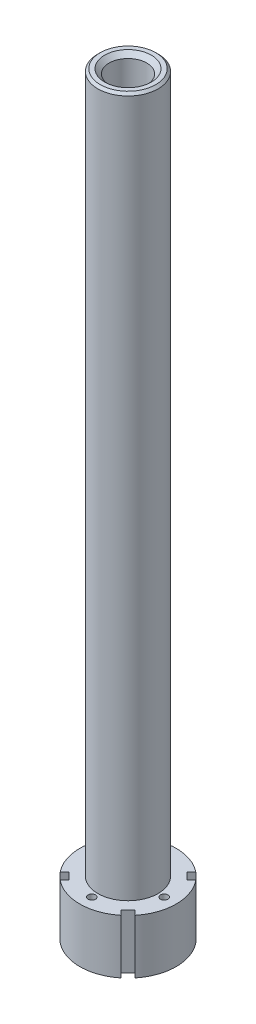
ISO-10303-21;
HEADER;
FILE_DESCRIPTION(('STEP AP214'),'2;1');
FILE_NAME('part.step','',(''),(''),'','','');
FILE_SCHEMA(('AUTOMOTIVE_DESIGN { 1 0 10303 214 1 1 1 1 }'));
ENDSEC;
DATA;
#1=APPLICATION_CONTEXT('core data for automotive mechanical design processes');
#2=APPLICATION_PROTOCOL_DEFINITION('international standard','automotive_design',2000,#1);
#3=PRODUCT_CONTEXT('',#1,'mechanical');
#4=PRODUCT('Part','Part','',(#3));
#5=PRODUCT_RELATED_PRODUCT_CATEGORY('part','',(#4));
#6=PRODUCT_DEFINITION_FORMATION('','',#4);
#7=PRODUCT_DEFINITION_CONTEXT('part definition',#1,'design');
#8=PRODUCT_DEFINITION('design','',#6,#7);
#9=PRODUCT_DEFINITION_SHAPE('','',#8);
#10=(LENGTH_UNIT() NAMED_UNIT(*) SI_UNIT(.MILLI.,.METRE.));
#11=(NAMED_UNIT(*) PLANE_ANGLE_UNIT() SI_UNIT($,.RADIAN.));
#12=(NAMED_UNIT(*) SI_UNIT($,.STERADIAN.) SOLID_ANGLE_UNIT());
#13=UNCERTAINTY_MEASURE_WITH_UNIT(LENGTH_MEASURE(1.E-05),#10,'distance_accuracy_value','');
#14=(GEOMETRIC_REPRESENTATION_CONTEXT(3) GLOBAL_UNCERTAINTY_ASSIGNED_CONTEXT((#13)) GLOBAL_UNIT_ASSIGNED_CONTEXT((#10,
#11,#12)) REPRESENTATION_CONTEXT('',''));
#15=CARTESIAN_POINT('',(0.,0.,0.));
#16=DIRECTION('',(0.,0.,1.));
#17=DIRECTION('',(1.,0.,0.));
#18=AXIS2_PLACEMENT_3D('',#15,#16,#17);
#19=CARTESIAN_POINT('',(0.,18.,0.));
#20=DIRECTION('',(0.,-1.,0.));
#21=DIRECTION('',(0.,0.,-1.));
#22=AXIS2_PLACEMENT_3D('',#19,#20,#21);
#23=CYLINDRICAL_SURFACE('',#22,16.);
#24=CARTESIAN_POINT('',(0.,0.,0.));
#25=DIRECTION('',(0.,-1.,0.));
#26=DIRECTION('',(0.,0.,-1.));
#27=AXIS2_PLACEMENT_3D('',#24,#25,#26);
#28=CIRCLE('',#27,16.);
#29=CARTESIAN_POINT('',(-10.1256269736777,0.,-12.3883686734748));
#30=VERTEX_POINT('',#29);
#31=CARTESIAN_POINT('',(10.1256269736778,0.,-12.3883686734747));
#32=VERTEX_POINT('',#31);
#33=EDGE_CURVE('E270',#30,#32,#28,.T.);
#34=ORIENTED_EDGE('',*,*,#33,.F.);
#35=DIRECTION('',(0.,-1.,0.));
#36=VECTOR('',#35,1.);
#37=CARTESIAN_POINT('',(-10.1256269736777,18.,-12.3883686734748));
#38=LINE('',#37,#36);
#39=CARTESIAN_POINT('',(-10.1256269736777,18.,-12.3883686734748));
#40=VERTEX_POINT('',#39);
#41=EDGE_CURVE('E197',#30,#40,#38,.F.);
#42=ORIENTED_EDGE('',*,*,#41,.T.);
#43=CARTESIAN_POINT('',(0.,18.,0.));
#44=DIRECTION('',(0.,-1.,0.));
#45=DIRECTION('',(0.,0.,-1.));
#46=AXIS2_PLACEMENT_3D('',#43,#44,#45);
#47=CIRCLE('',#46,16.);
#48=CARTESIAN_POINT('',(10.1256269736778,18.,-12.3883686734747));
#49=VERTEX_POINT('',#48);
#50=EDGE_CURVE('E266',#40,#49,#47,.T.);
#51=ORIENTED_EDGE('',*,*,#50,.T.);
#52=DIRECTION('',(0.,-1.,0.));
#53=VECTOR('',#52,1.);
#54=CARTESIAN_POINT('',(10.1256269736778,18.,-12.3883686734747));
#55=LINE('',#54,#53);
#56=EDGE_CURVE('E192',#32,#49,#55,.F.);
#57=ORIENTED_EDGE('',*,*,#56,.F.);
#58=EDGE_LOOP('',(#34,#42,#51,#57));
#59=FACE_BOUND('',#58,.T.);
#60=ADVANCED_FACE('F45',(#59),#23,.T.);
#61=CARTESIAN_POINT('',(12.3883686734747,0.,-10.1256269736777));
#62=VERTEX_POINT('',#61);
#63=CARTESIAN_POINT('',(12.3883686734746,0.,10.1256269736779));
#64=VERTEX_POINT('',#63);
#65=EDGE_CURVE('E392',#62,#64,#28,.T.);
#66=ORIENTED_EDGE('',*,*,#65,.F.);
#67=DIRECTION('',(0.,-1.,0.));
#68=VECTOR('',#67,1.);
#69=CARTESIAN_POINT('',(12.3883686734747,18.,-10.1256269736777));
#70=LINE('',#69,#68);
#71=CARTESIAN_POINT('',(12.3883686734747,18.,-10.1256269736777));
#72=VERTEX_POINT('',#71);
#73=EDGE_CURVE('E68',#62,#72,#70,.F.);
#74=ORIENTED_EDGE('',*,*,#73,.T.);
#75=CARTESIAN_POINT('',(12.3883686734746,18.,10.1256269736779));
#76=VERTEX_POINT('',#75);
#77=EDGE_CURVE('E400',#72,#76,#47,.T.);
#78=ORIENTED_EDGE('',*,*,#77,.T.);
#79=DIRECTION('',(0.,-1.,0.));
#80=VECTOR('',#79,1.);
#81=CARTESIAN_POINT('',(12.3883686734746,18.,10.1256269736779));
#82=LINE('',#81,#80);
#83=EDGE_CURVE('E169',#64,#76,#82,.F.);
#84=ORIENTED_EDGE('',*,*,#83,.F.);
#85=EDGE_LOOP('',(#66,#74,#78,#84));
#86=FACE_BOUND('',#85,.T.);
#87=ADVANCED_FACE('F328',(#86),#23,.T.);
#88=CARTESIAN_POINT('',(10.1256269736776,0.,12.3883686734748));
#89=VERTEX_POINT('',#88);
#90=CARTESIAN_POINT('',(-10.1256269736778,0.,12.3883686734747));
#91=VERTEX_POINT('',#90);
#92=EDGE_CURVE('E271',#89,#91,#28,.T.);
#93=ORIENTED_EDGE('',*,*,#92,.F.);
#94=DIRECTION('',(0.,-1.,0.));
#95=VECTOR('',#94,1.);
#96=CARTESIAN_POINT('',(10.1256269736776,18.,12.3883686734748));
#97=LINE('',#96,#95);
#98=CARTESIAN_POINT('',(10.1256269736776,18.,12.3883686734748));
#99=VERTEX_POINT('',#98);
#100=EDGE_CURVE('E60',#89,#99,#97,.F.);
#101=ORIENTED_EDGE('',*,*,#100,.T.);
#102=CARTESIAN_POINT('',(-10.1256269736778,18.,12.3883686734747));
#103=VERTEX_POINT('',#102);
#104=EDGE_CURVE('E179',#99,#103,#47,.T.);
#105=ORIENTED_EDGE('',*,*,#104,.T.);
#106=DIRECTION('',(0.,-1.,0.));
#107=VECTOR('',#106,1.);
#108=CARTESIAN_POINT('',(-10.1256269736778,18.,12.3883686734747));
#109=LINE('',#108,#107);
#110=EDGE_CURVE('E222',#91,#103,#109,.F.);
#111=ORIENTED_EDGE('',*,*,#110,.F.);
#112=EDGE_LOOP('',(#93,#101,#105,#111));
#113=FACE_BOUND('',#112,.T.);
#114=ADVANCED_FACE('F336',(#113),#23,.T.);
#115=DIRECTION('',(0.,-1.,0.));
#116=VECTOR('',#115,1.);
#117=CARTESIAN_POINT('',(-12.3883686734747,18.,-10.1256269736778));
#118=LINE('',#117,#116);
#119=CARTESIAN_POINT('',(-12.3883686734747,0.,-10.1256269736778));
#120=VERTEX_POINT('',#119);
#121=CARTESIAN_POINT('',(-12.3883686734747,18.,-10.1256269736778));
#122=VERTEX_POINT('',#121);
#123=EDGE_CURVE('E204',#120,#122,#118,.F.);
#124=ORIENTED_EDGE('',*,*,#123,.F.);
#125=CARTESIAN_POINT('',(-12.3883686734747,0.,10.1256269736777));
#126=VERTEX_POINT('',#125);
#127=EDGE_CURVE('E267',#126,#120,#28,.T.);
#128=ORIENTED_EDGE('',*,*,#127,.F.);
#129=DIRECTION('',(0.,-1.,0.));
#130=VECTOR('',#129,1.);
#131=CARTESIAN_POINT('',(-12.3883686734747,18.,10.1256269736777));
#132=LINE('',#131,#130);
#133=CARTESIAN_POINT('',(-12.3883686734747,18.,10.1256269736777));
#134=VERTEX_POINT('',#133);
#135=EDGE_CURVE('E213',#126,#134,#132,.F.);
#136=ORIENTED_EDGE('',*,*,#135,.T.);
#137=EDGE_CURVE('E262',#134,#122,#47,.T.);
#138=ORIENTED_EDGE('',*,*,#137,.T.);
#139=EDGE_LOOP('',(#124,#128,#136,#138));
#140=FACE_BOUND('',#139,.T.);
#141=ADVANCED_FACE('F331',(#140),#23,.T.);
#142=CARTESIAN_POINT('',(0.,-40.,0.));
#143=DIRECTION('',(0.,1.,0.));
#144=DIRECTION('',(0.,0.,1.));
#145=AXIS2_PLACEMENT_3D('',#142,#143,#144);
#146=CYLINDRICAL_SURFACE('',#145,6.);
#147=CARTESIAN_POINT('',(0.,214.849784845243,0.));
#148=DIRECTION('',(0.,1.,0.));
#149=DIRECTION('',(0.,0.,1.));
#150=AXIS2_PLACEMENT_3D('',#147,#148,#149);
#151=CIRCLE('',#150,6.);
#152=CARTESIAN_POINT('',(0.,214.849784845243,6.));
#153=VERTEX_POINT('',#152);
#154=EDGE_CURVE('E261',#153,#153,#151,.F.);
#155=ORIENTED_EDGE('',*,*,#154,.F.);
#156=EDGE_LOOP('',(#155));
#157=FACE_BOUND('',#156,.T.);
#158=CARTESIAN_POINT('',(0.,15.5,0.));
#159=DIRECTION('',(0.,-1.,0.));
#160=DIRECTION('',(0.,0.,-1.));
#161=AXIS2_PLACEMENT_3D('',#158,#159,#160);
#162=CIRCLE('',#161,6.);
#163=CARTESIAN_POINT('',(0.,15.5,-6.));
#164=VERTEX_POINT('',#163);
#165=EDGE_CURVE('E255',#164,#164,#162,.T.);
#166=ORIENTED_EDGE('',*,*,#165,.T.);
#167=EDGE_LOOP('',(#166));
#168=FACE_BOUND('',#167,.T.);
#169=ADVANCED_FACE('F342',(#157,#168),#146,.F.);
#170=CARTESIAN_POINT('',(0.,250.,0.));
#171=DIRECTION('',(0.,-1.,0.));
#172=DIRECTION('',(0.,0.,-1.));
#173=AXIS2_PLACEMENT_3D('',#170,#171,#172);
#174=CYLINDRICAL_SURFACE('',#173,10.);
#175=CARTESIAN_POINT('',(0.,249.2,0.));
#176=DIRECTION('',(0.,1.,0.));
#177=DIRECTION('',(0.,0.,1.));
#178=AXIS2_PLACEMENT_3D('',#175,#176,#177);
#179=CIRCLE('',#178,10.);
#180=CARTESIAN_POINT('',(0.,249.2,10.));
#181=VERTEX_POINT('',#180);
#182=EDGE_CURVE('E11',#181,#181,#179,.F.);
#183=ORIENTED_EDGE('',*,*,#182,.T.);
#184=EDGE_LOOP('',(#183));
#185=FACE_BOUND('',#184,.T.);
#186=CARTESIAN_POINT('',(0.,18.,0.));
#187=DIRECTION('',(0.,-1.,0.));
#188=DIRECTION('',(0.,0.,-1.));
#189=AXIS2_PLACEMENT_3D('',#186,#187,#188);
#190=CIRCLE('',#189,10.);
#191=CARTESIAN_POINT('',(0.,18.,-10.));
#192=VERTEX_POINT('',#191);
#193=EDGE_CURVE('E265',#192,#192,#190,.T.);
#194=ORIENTED_EDGE('',*,*,#193,.F.);
#195=EDGE_LOOP('',(#194));
#196=FACE_BOUND('',#195,.T.);
#197=ADVANCED_FACE('F349',(#185,#196),#174,.T.);
#198=CARTESIAN_POINT('',(0.,250.,0.));
#199=DIRECTION('',(0.,1.,0.));
#200=DIRECTION('',(0.,0.,1.));
#201=AXIS2_PLACEMENT_3D('',#198,#199,#200);
#202=PLANE('',#201);
#203=CARTESIAN_POINT('',(0.,250.,0.));
#204=DIRECTION('',(0.,1.,0.));
#205=DIRECTION('',(0.,0.,1.));
#206=AXIS2_PLACEMENT_3D('',#203,#204,#205);
#207=CIRCLE('',#206,9.20000000000004);
#208=CARTESIAN_POINT('',(0.,250.,9.20000000000004));
#209=VERTEX_POINT('',#208);
#210=EDGE_CURVE('E53',#209,#209,#207,.T.);
#211=ORIENTED_EDGE('',*,*,#210,.T.);
#212=EDGE_LOOP('',(#211));
#213=FACE_BOUND('',#212,.T.);
#214=CARTESIAN_POINT('',(0.,250.,0.));
#215=DIRECTION('',(0.,1.,0.));
#216=DIRECTION('',(0.,0.,1.));
#217=AXIS2_PLACEMENT_3D('',#214,#215,#216);
#218=CIRCLE('',#217,7.75000000000006);
#219=CARTESIAN_POINT('',(0.,250.,7.75000000000006));
#220=VERTEX_POINT('',#219);
#221=EDGE_CURVE('E279',#220,#220,#218,.F.);
#222=ORIENTED_EDGE('',*,*,#221,.T.);
#223=EDGE_LOOP('',(#222));
#224=FACE_BOUND('',#223,.T.);
#225=ADVANCED_FACE('F313',(#213,#224),#202,.T.);
#226=CARTESIAN_POINT('',(0.,18.,0.));
#227=DIRECTION('',(0.,-1.,0.));
#228=DIRECTION('',(0.,0.,-1.));
#229=AXIS2_PLACEMENT_3D('',#226,#227,#228);
#230=PLANE('',#229);
#231=CARTESIAN_POINT('',(0.,18.,-12.));
#232=DIRECTION('',(0.,-1.,0.));
#233=DIRECTION('',(0.,0.,-1.));
#234=AXIS2_PLACEMENT_3D('',#231,#232,#233);
#235=CIRCLE('',#234,1.25);
#236=CARTESIAN_POINT('',(0.,18.,-13.25));
#237=VERTEX_POINT('',#236);
#238=EDGE_CURVE('E230',#237,#237,#235,.T.);
#239=ORIENTED_EDGE('',*,*,#238,.T.);
#240=EDGE_LOOP('',(#239));
#241=FACE_BOUND('',#240,.T.);
#242=CARTESIAN_POINT('',(-12.,18.,0.));
#243=DIRECTION('',(0.,-1.,0.));
#244=DIRECTION('',(0.,0.,-1.));
#245=AXIS2_PLACEMENT_3D('',#242,#243,#244);
#246=CIRCLE('',#245,1.25);
#247=CARTESIAN_POINT('',(-12.,18.,-1.25));
#248=VERTEX_POINT('',#247);
#249=EDGE_CURVE('E236',#248,#248,#246,.T.);
#250=ORIENTED_EDGE('',*,*,#249,.T.);
#251=EDGE_LOOP('',(#250));
#252=FACE_BOUND('',#251,.T.);
#253=CARTESIAN_POINT('',(0.,18.,12.));
#254=DIRECTION('',(0.,-1.,0.));
#255=DIRECTION('',(0.,0.,-1.));
#256=AXIS2_PLACEMENT_3D('',#253,#254,#255);
#257=CIRCLE('',#256,1.25);
#258=CARTESIAN_POINT('',(0.,18.,10.75));
#259=VERTEX_POINT('',#258);
#260=EDGE_CURVE('E242',#259,#259,#257,.T.);
#261=ORIENTED_EDGE('',*,*,#260,.T.);
#262=EDGE_LOOP('',(#261));
#263=FACE_BOUND('',#262,.T.);
#264=CARTESIAN_POINT('',(12.,18.,0.));
#265=DIRECTION('',(0.,-1.,0.));
#266=DIRECTION('',(0.,0.,-1.));
#267=AXIS2_PLACEMENT_3D('',#264,#265,#266);
#268=CIRCLE('',#267,1.25);
#269=CARTESIAN_POINT('',(12.,18.,-1.25));
#270=VERTEX_POINT('',#269);
#271=EDGE_CURVE('E248',#270,#270,#268,.T.);
#272=ORIENTED_EDGE('',*,*,#271,.T.);
#273=EDGE_LOOP('',(#272));
#274=FACE_BOUND('',#273,.T.);
#275=ORIENTED_EDGE('',*,*,#193,.T.);
#276=EDGE_LOOP('',(#275));
#277=FACE_BOUND('',#276,.T.);
#278=DIRECTION('',(0.707106781186552,0.,-0.707106781186543));
#279=VECTOR('',#278,1.);
#280=CARTESIAN_POINT('',(-9.7580735803743,18.,-9.75807358037441));
#281=LINE('',#280,#279);
#282=CARTESIAN_POINT('',(-10.8894444302728,18.,-8.62670273047594));
#283=VERTEX_POINT('',#282);
#284=CARTESIAN_POINT('',(-8.62670273047582,18.,-10.8894444302729));
#285=VERTEX_POINT('',#284);
#286=EDGE_CURVE('E202',#283,#285,#281,.T.);
#287=ORIENTED_EDGE('',*,*,#286,.F.);
#288=DIRECTION('',(-0.707106781186543,0.,-0.707106781186552));
#289=VECTOR('',#288,1.);
#290=CARTESIAN_POINT('',(-1.13137084989849,18.,1.13137084989848));
#291=LINE('',#290,#289);
#292=EDGE_CURVE('E206',#283,#122,#291,.T.);
#293=ORIENTED_EDGE('',*,*,#292,.T.);
#294=ORIENTED_EDGE('',*,*,#137,.F.);
#295=DIRECTION('',(-0.707106781186549,0.,0.707106781186546));
#296=VECTOR('',#295,1.);
#297=CARTESIAN_POINT('',(-1.13137084989847,18.,-1.13137084989847));
#298=LINE('',#297,#296);
#299=CARTESIAN_POINT('',(-10.8894444302728,18.,8.62670273047586));
#300=VERTEX_POINT('',#299);
#301=EDGE_CURVE('E218',#300,#134,#298,.T.);
#302=ORIENTED_EDGE('',*,*,#301,.F.);
#303=DIRECTION('',(-0.707106781186546,0.,-0.707106781186549));
#304=VECTOR('',#303,1.);
#305=CARTESIAN_POINT('',(-9.75807358037438,18.,9.75807358037433));
#306=LINE('',#305,#304);
#307=CARTESIAN_POINT('',(-8.6267027304759,18.,10.8894444302728));
#308=VERTEX_POINT('',#307);
#309=EDGE_CURVE('E220',#308,#300,#306,.T.);
#310=ORIENTED_EDGE('',*,*,#309,.F.);
#311=DIRECTION('',(-0.707106781186549,0.,0.707106781186546));
#312=VECTOR('',#311,1.);
#313=CARTESIAN_POINT('',(1.13137084989848,18.,1.13137084989849));
#314=LINE('',#313,#312);
#315=EDGE_CURVE('E225',#308,#103,#314,.T.);
#316=ORIENTED_EDGE('',*,*,#315,.T.);
#317=ORIENTED_EDGE('',*,*,#104,.F.);
#318=DIRECTION('',(0.707106781186538,0.,0.707106781186557));
#319=VECTOR('',#318,1.);
#320=CARTESIAN_POINT('',(-1.13137084989848,18.,1.13137084989845));
#321=LINE('',#320,#319);
#322=CARTESIAN_POINT('',(8.62670273047574,18.,10.8894444302729));
#323=VERTEX_POINT('',#322);
#324=EDGE_CURVE('E170',#323,#99,#321,.T.);
#325=ORIENTED_EDGE('',*,*,#324,.F.);
#326=DIRECTION('',(-0.707106781186557,0.,0.707106781186538));
#327=VECTOR('',#326,1.);
#328=CARTESIAN_POINT('',(9.75807358037423,18.,9.75807358037448));
#329=LINE('',#328,#327);
#330=CARTESIAN_POINT('',(10.8894444302727,18.,8.62670273047601));
#331=VERTEX_POINT('',#330);
#332=EDGE_CURVE('E159',#331,#323,#329,.T.);
#333=ORIENTED_EDGE('',*,*,#332,.F.);
#334=DIRECTION('',(0.707106781186538,0.,0.707106781186557));
#335=VECTOR('',#334,1.);
#336=CARTESIAN_POINT('',(1.1313708498985,18.,-1.13137084989847));
#337=LINE('',#336,#335);
#338=EDGE_CURVE('E185',#331,#76,#337,.T.);
#339=ORIENTED_EDGE('',*,*,#338,.T.);
#340=ORIENTED_EDGE('',*,*,#77,.F.);
#341=DIRECTION('',(0.707106781186549,0.,-0.707106781186546));
#342=VECTOR('',#341,1.);
#343=CARTESIAN_POINT('',(1.13137084989847,18.,1.13137084989847));
#344=LINE('',#343,#342);
#345=CARTESIAN_POINT('',(10.8894444302728,18.,-8.62670273047586));
#346=VERTEX_POINT('',#345);
#347=EDGE_CURVE('E188',#346,#72,#344,.T.);
#348=ORIENTED_EDGE('',*,*,#347,.F.);
#349=DIRECTION('',(0.707106781186546,0.,0.707106781186549));
#350=VECTOR('',#349,1.);
#351=CARTESIAN_POINT('',(9.75807358037438,18.,-9.75807358037433));
#352=LINE('',#351,#350);
#353=CARTESIAN_POINT('',(8.6267027304759,18.,-10.8894444302728));
#354=VERTEX_POINT('',#353);
#355=EDGE_CURVE('E190',#354,#346,#352,.T.);
#356=ORIENTED_EDGE('',*,*,#355,.F.);
#357=DIRECTION('',(0.707106781186549,0.,-0.707106781186546));
#358=VECTOR('',#357,1.);
#359=CARTESIAN_POINT('',(-1.13137084989848,18.,-1.13137084989849));
#360=LINE('',#359,#358);
#361=EDGE_CURVE('E194',#354,#49,#360,.T.);
#362=ORIENTED_EDGE('',*,*,#361,.T.);
#363=ORIENTED_EDGE('',*,*,#50,.F.);
#364=DIRECTION('',(-0.707106781186543,0.,-0.707106781186552));
#365=VECTOR('',#364,1.);
#366=CARTESIAN_POINT('',(1.13137084989848,18.,-1.13137084989846));
#367=LINE('',#366,#365);
#368=EDGE_CURVE('E200',#285,#40,#367,.T.);
#369=ORIENTED_EDGE('',*,*,#368,.F.);
#370=EDGE_LOOP('',(#287,#293,#294,#302,#310,#316,#317,#325,#333,#339,#340,#348,#356,#362,#363,#369));
#371=FACE_BOUND('',#370,.T.);
#372=ADVANCED_FACE('F177',(#241,#252,#263,#274,#277,#371),#230,.F.);
#373=CARTESIAN_POINT('',(0.,0.,0.));
#374=DIRECTION('',(0.,1.,0.));
#375=DIRECTION('',(0.,0.,1.));
#376=AXIS2_PLACEMENT_3D('',#373,#374,#375);
#377=PLANE('',#376);
#378=CARTESIAN_POINT('',(0.,0.,-12.));
#379=DIRECTION('',(0.,-1.,0.));
#380=DIRECTION('',(0.,0.,-1.));
#381=AXIS2_PLACEMENT_3D('',#378,#379,#380);
#382=CIRCLE('',#381,1.25);
#383=CARTESIAN_POINT('',(0.,0.,-13.25));
#384=VERTEX_POINT('',#383);
#385=EDGE_CURVE('E227',#384,#384,#382,.T.);
#386=ORIENTED_EDGE('',*,*,#385,.F.);
#387=EDGE_LOOP('',(#386));
#388=FACE_BOUND('',#387,.T.);
#389=CARTESIAN_POINT('',(-12.,0.,0.));
#390=DIRECTION('',(0.,-1.,0.));
#391=DIRECTION('',(0.,0.,-1.));
#392=AXIS2_PLACEMENT_3D('',#389,#390,#391);
#393=CIRCLE('',#392,1.25);
#394=CARTESIAN_POINT('',(-12.,0.,-1.25));
#395=VERTEX_POINT('',#394);
#396=EDGE_CURVE('E233',#395,#395,#393,.T.);
#397=ORIENTED_EDGE('',*,*,#396,.F.);
#398=EDGE_LOOP('',(#397));
#399=FACE_BOUND('',#398,.T.);
#400=CARTESIAN_POINT('',(0.,0.,12.));
#401=DIRECTION('',(0.,-1.,0.));
#402=DIRECTION('',(0.,0.,-1.));
#403=AXIS2_PLACEMENT_3D('',#400,#401,#402);
#404=CIRCLE('',#403,1.25);
#405=CARTESIAN_POINT('',(0.,0.,10.75));
#406=VERTEX_POINT('',#405);
#407=EDGE_CURVE('E239',#406,#406,#404,.T.);
#408=ORIENTED_EDGE('',*,*,#407,.F.);
#409=EDGE_LOOP('',(#408));
#410=FACE_BOUND('',#409,.T.);
#411=CARTESIAN_POINT('',(12.,0.,0.));
#412=DIRECTION('',(0.,-1.,0.));
#413=DIRECTION('',(0.,0.,-1.));
#414=AXIS2_PLACEMENT_3D('',#411,#412,#413);
#415=CIRCLE('',#414,1.25);
#416=CARTESIAN_POINT('',(12.,0.,-1.25));
#417=VERTEX_POINT('',#416);
#418=EDGE_CURVE('E245',#417,#417,#415,.T.);
#419=ORIENTED_EDGE('',*,*,#418,.F.);
#420=EDGE_LOOP('',(#419));
#421=FACE_BOUND('',#420,.T.);
#422=CARTESIAN_POINT('',(0.,0.,0.));
#423=DIRECTION('',(0.,-1.,0.));
#424=DIRECTION('',(0.,0.,-1.));
#425=AXIS2_PLACEMENT_3D('',#422,#423,#424);
#426=CIRCLE('',#425,8.);
#427=CARTESIAN_POINT('',(0.,0.,-8.));
#428=VERTEX_POINT('',#427);
#429=EDGE_CURVE('E251',#428,#428,#426,.T.);
#430=ORIENTED_EDGE('',*,*,#429,.F.);
#431=EDGE_LOOP('',(#430));
#432=FACE_BOUND('',#431,.T.);
#433=ORIENTED_EDGE('',*,*,#127,.T.);
#434=DIRECTION('',(0.707106781186543,0.,0.707106781186552));
#435=VECTOR('',#434,1.);
#436=CARTESIAN_POINT('',(-1.13137084989849,0.,1.13137084989848));
#437=LINE('',#436,#435);
#438=CARTESIAN_POINT('',(-10.8894444302728,0.,-8.62670273047594));
#439=VERTEX_POINT('',#438);
#440=EDGE_CURVE('E308',#120,#439,#437,.T.);
#441=ORIENTED_EDGE('',*,*,#440,.T.);
#442=DIRECTION('',(-0.707106781186552,0.,0.707106781186543));
#443=VECTOR('',#442,1.);
#444=CARTESIAN_POINT('',(-9.7580735803743,0.,-9.75807358037441));
#445=LINE('',#444,#443);
#446=CARTESIAN_POINT('',(-8.62670273047582,0.,-10.8894444302729));
#447=VERTEX_POINT('',#446);
#448=EDGE_CURVE('E306',#447,#439,#445,.T.);
#449=ORIENTED_EDGE('',*,*,#448,.F.);
#450=DIRECTION('',(0.707106781186543,0.,0.707106781186552));
#451=VECTOR('',#450,1.);
#452=CARTESIAN_POINT('',(1.13137084989848,0.,-1.13137084989846));
#453=LINE('',#452,#451);
#454=EDGE_CURVE('E304',#30,#447,#453,.T.);
#455=ORIENTED_EDGE('',*,*,#454,.F.);
#456=ORIENTED_EDGE('',*,*,#33,.T.);
#457=DIRECTION('',(-0.707106781186549,0.,0.707106781186546));
#458=VECTOR('',#457,1.);
#459=CARTESIAN_POINT('',(-1.13137084989848,0.,-1.13137084989849));
#460=LINE('',#459,#458);
#461=CARTESIAN_POINT('',(8.6267027304759,0.,-10.8894444302728));
#462=VERTEX_POINT('',#461);
#463=EDGE_CURVE('E301',#32,#462,#460,.T.);
#464=ORIENTED_EDGE('',*,*,#463,.T.);
#465=DIRECTION('',(-0.707106781186546,0.,-0.707106781186549));
#466=VECTOR('',#465,1.);
#467=CARTESIAN_POINT('',(9.75807358037438,0.,-9.75807358037433));
#468=LINE('',#467,#466);
#469=CARTESIAN_POINT('',(10.8894444302728,0.,-8.62670273047586));
#470=VERTEX_POINT('',#469);
#471=EDGE_CURVE('E299',#470,#462,#468,.T.);
#472=ORIENTED_EDGE('',*,*,#471,.F.);
#473=DIRECTION('',(-0.707106781186549,0.,0.707106781186546));
#474=VECTOR('',#473,1.);
#475=CARTESIAN_POINT('',(1.13137084989847,0.,1.13137084989847));
#476=LINE('',#475,#474);
#477=EDGE_CURVE('E297',#62,#470,#476,.T.);
#478=ORIENTED_EDGE('',*,*,#477,.F.);
#479=ORIENTED_EDGE('',*,*,#65,.T.);
#480=DIRECTION('',(-0.707106781186538,0.,-0.707106781186557));
#481=VECTOR('',#480,1.);
#482=CARTESIAN_POINT('',(1.1313708498985,0.,-1.13137084989847));
#483=LINE('',#482,#481);
#484=CARTESIAN_POINT('',(10.8894444302727,0.,8.62670273047601));
#485=VERTEX_POINT('',#484);
#486=EDGE_CURVE('E294',#64,#485,#483,.T.);
#487=ORIENTED_EDGE('',*,*,#486,.T.);
#488=DIRECTION('',(0.707106781186557,0.,-0.707106781186538));
#489=VECTOR('',#488,1.);
#490=CARTESIAN_POINT('',(9.75807358037423,0.,9.75807358037448));
#491=LINE('',#490,#489);
#492=CARTESIAN_POINT('',(8.62670273047574,0.,10.8894444302729));
#493=VERTEX_POINT('',#492);
#494=EDGE_CURVE('E292',#493,#485,#491,.T.);
#495=ORIENTED_EDGE('',*,*,#494,.F.);
#496=DIRECTION('',(-0.707106781186538,0.,-0.707106781186557));
#497=VECTOR('',#496,1.);
#498=CARTESIAN_POINT('',(-1.13137084989848,0.,1.13137084989845));
#499=LINE('',#498,#497);
#500=EDGE_CURVE('E173',#89,#493,#499,.T.);
#501=ORIENTED_EDGE('',*,*,#500,.F.);
#502=ORIENTED_EDGE('',*,*,#92,.T.);
#503=DIRECTION('',(0.707106781186549,0.,-0.707106781186546));
#504=VECTOR('',#503,1.);
#505=CARTESIAN_POINT('',(1.13137084989848,0.,1.13137084989849));
#506=LINE('',#505,#504);
#507=CARTESIAN_POINT('',(-8.6267027304759,0.,10.8894444302728));
#508=VERTEX_POINT('',#507);
#509=EDGE_CURVE('E288',#91,#508,#506,.T.);
#510=ORIENTED_EDGE('',*,*,#509,.T.);
#511=DIRECTION('',(0.707106781186546,0.,0.707106781186549));
#512=VECTOR('',#511,1.);
#513=CARTESIAN_POINT('',(-9.75807358037438,0.,9.75807358037433));
#514=LINE('',#513,#512);
#515=CARTESIAN_POINT('',(-10.8894444302728,0.,8.62670273047586));
#516=VERTEX_POINT('',#515);
#517=EDGE_CURVE('E286',#516,#508,#514,.T.);
#518=ORIENTED_EDGE('',*,*,#517,.F.);
#519=DIRECTION('',(0.707106781186549,0.,-0.707106781186546));
#520=VECTOR('',#519,1.);
#521=CARTESIAN_POINT('',(-1.13137084989847,0.,-1.13137084989847));
#522=LINE('',#521,#520);
#523=EDGE_CURVE('E282',#126,#516,#522,.T.);
#524=ORIENTED_EDGE('',*,*,#523,.F.);
#525=EDGE_LOOP('',(#433,#441,#449,#455,#456,#464,#472,#478,#479,#487,#495,#501,#502,#510,#518,#524));
#526=FACE_BOUND('',#525,.T.);
#527=ADVANCED_FACE('F359',(#388,#399,#410,#421,#432,#526),#377,.F.);
#528=CARTESIAN_POINT('',(0.,215.,0.));
#529=DIRECTION('',(0.,1.,0.));
#530=DIRECTION('',(0.,0.,1.));
#531=AXIS2_PLACEMENT_3D('',#528,#529,#530);
#532=CONICAL_SURFACE('',#531,6.24999999999999,1.02974425867665);
#533=ORIENTED_EDGE('',*,*,#154,.T.);
#534=EDGE_LOOP('',(#533));
#535=FACE_BOUND('',#534,.T.);
#536=CARTESIAN_POINT('',(0.,215.,0.));
#537=DIRECTION('',(0.,1.,0.));
#538=DIRECTION('',(0.,0.,1.));
#539=AXIS2_PLACEMENT_3D('',#536,#537,#538);
#540=CIRCLE('',#539,6.24999999999999);
#541=CARTESIAN_POINT('',(0.,215.,6.24999999999999));
#542=VERTEX_POINT('',#541);
#543=EDGE_CURVE('E258',#542,#542,#540,.T.);
#544=ORIENTED_EDGE('',*,*,#543,.T.);
#545=EDGE_LOOP('',(#544));
#546=FACE_BOUND('',#545,.T.);
#547=ADVANCED_FACE('F466',(#535,#546),#532,.F.);
#548=CARTESIAN_POINT('',(0.,250.,0.));
#549=DIRECTION('',(0.,1.,0.));
#550=DIRECTION('',(0.,0.,1.));
#551=AXIS2_PLACEMENT_3D('',#548,#549,#550);
#552=CYLINDRICAL_SURFACE('',#551,6.25);
#553=CARTESIAN_POINT('',(0.,248.5,0.));
#554=DIRECTION('',(0.,1.,0.));
#555=DIRECTION('',(0.,0.,1.));
#556=AXIS2_PLACEMENT_3D('',#553,#554,#555);
#557=CIRCLE('',#556,6.25);
#558=CARTESIAN_POINT('',(0.,248.5,6.25));
#559=VERTEX_POINT('',#558);
#560=EDGE_CURVE('E274',#559,#559,#557,.T.);
#561=ORIENTED_EDGE('',*,*,#560,.T.);
#562=EDGE_LOOP('',(#561));
#563=FACE_BOUND('',#562,.T.);
#564=ORIENTED_EDGE('',*,*,#543,.F.);
#565=EDGE_LOOP('',(#564));
#566=FACE_BOUND('',#565,.T.);
#567=ADVANCED_FACE('F463',(#563,#566),#552,.F.);
#568=CARTESIAN_POINT('',(0.,248.5,0.));
#569=DIRECTION('',(0.,1.,0.));
#570=DIRECTION('',(0.,0.,1.));
#571=AXIS2_PLACEMENT_3D('',#568,#569,#570);
#572=CONICAL_SURFACE('',#571,6.25,0.785398163397442);
#573=ORIENTED_EDGE('',*,*,#221,.F.);
#574=EDGE_LOOP('',(#573));
#575=FACE_BOUND('',#574,.T.);
#576=ORIENTED_EDGE('',*,*,#560,.F.);
#577=EDGE_LOOP('',(#576));
#578=FACE_BOUND('',#577,.T.);
#579=ADVANCED_FACE('F461',(#575,#578),#572,.F.);
#580=CARTESIAN_POINT('',(0.,15.5,0.));
#581=DIRECTION('',(0.,-1.,0.));
#582=DIRECTION('',(0.,0.,-1.));
#583=AXIS2_PLACEMENT_3D('',#580,#581,#582);
#584=CYLINDRICAL_SURFACE('',#583,8.);
#585=CARTESIAN_POINT('',(0.,15.5,0.));
#586=DIRECTION('',(0.,-1.,0.));
#587=DIRECTION('',(0.,0.,-1.));
#588=AXIS2_PLACEMENT_3D('',#585,#586,#587);
#589=CIRCLE('',#588,8.);
#590=CARTESIAN_POINT('',(0.,15.5,-8.));
#591=VERTEX_POINT('',#590);
#592=EDGE_CURVE('E252',#591,#591,#589,.T.);
#593=ORIENTED_EDGE('',*,*,#592,.F.);
#594=EDGE_LOOP('',(#593));
#595=FACE_BOUND('',#594,.T.);
#596=ORIENTED_EDGE('',*,*,#429,.T.);
#597=EDGE_LOOP('',(#596));
#598=FACE_BOUND('',#597,.T.);
#599=ADVANCED_FACE('F457',(#595,#598),#584,.F.);
#600=CARTESIAN_POINT('',(0.,15.5,0.));
#601=DIRECTION('',(0.,-1.,0.));
#602=DIRECTION('',(0.,0.,-1.));
#603=AXIS2_PLACEMENT_3D('',#600,#601,#602);
#604=PLANE('',#603);
#605=ORIENTED_EDGE('',*,*,#165,.F.);
#606=EDGE_LOOP('',(#605));
#607=FACE_BOUND('',#606,.T.);
#608=ORIENTED_EDGE('',*,*,#592,.T.);
#609=EDGE_LOOP('',(#608));
#610=FACE_BOUND('',#609,.T.);
#611=ADVANCED_FACE('F453',(#607,#610),#604,.T.);
#612=CARTESIAN_POINT('',(12.,0.,0.));
#613=DIRECTION('',(0.,-1.,0.));
#614=DIRECTION('',(0.,0.,-1.));
#615=AXIS2_PLACEMENT_3D('',#612,#613,#614);
#616=CYLINDRICAL_SURFACE('',#615,1.25);
#617=ORIENTED_EDGE('',*,*,#418,.T.);
#618=EDGE_LOOP('',(#617));
#619=FACE_BOUND('',#618,.T.);
#620=ORIENTED_EDGE('',*,*,#271,.F.);
#621=EDGE_LOOP('',(#620));
#622=FACE_BOUND('',#621,.T.);
#623=ADVANCED_FACE('F449',(#619,#622),#616,.F.);
#624=CARTESIAN_POINT('',(0.,0.,12.));
#625=DIRECTION('',(0.,-1.,0.));
#626=DIRECTION('',(0.,0.,-1.));
#627=AXIS2_PLACEMENT_3D('',#624,#625,#626);
#628=CYLINDRICAL_SURFACE('',#627,1.25);
#629=ORIENTED_EDGE('',*,*,#407,.T.);
#630=EDGE_LOOP('',(#629));
#631=FACE_BOUND('',#630,.T.);
#632=ORIENTED_EDGE('',*,*,#260,.F.);
#633=EDGE_LOOP('',(#632));
#634=FACE_BOUND('',#633,.T.);
#635=ADVANCED_FACE('F445',(#631,#634),#628,.F.);
#636=CARTESIAN_POINT('',(-12.,0.,0.));
#637=DIRECTION('',(0.,-1.,0.));
#638=DIRECTION('',(0.,0.,-1.));
#639=AXIS2_PLACEMENT_3D('',#636,#637,#638);
#640=CYLINDRICAL_SURFACE('',#639,1.25);
#641=ORIENTED_EDGE('',*,*,#396,.T.);
#642=EDGE_LOOP('',(#641));
#643=FACE_BOUND('',#642,.T.);
#644=ORIENTED_EDGE('',*,*,#249,.F.);
#645=EDGE_LOOP('',(#644));
#646=FACE_BOUND('',#645,.T.);
#647=ADVANCED_FACE('F441',(#643,#646),#640,.F.);
#648=CARTESIAN_POINT('',(0.,0.,-12.));
#649=DIRECTION('',(0.,-1.,0.));
#650=DIRECTION('',(0.,0.,-1.));
#651=AXIS2_PLACEMENT_3D('',#648,#649,#650);
#652=CYLINDRICAL_SURFACE('',#651,1.25);
#653=ORIENTED_EDGE('',*,*,#385,.T.);
#654=EDGE_LOOP('',(#653));
#655=FACE_BOUND('',#654,.T.);
#656=ORIENTED_EDGE('',*,*,#238,.F.);
#657=EDGE_LOOP('',(#656));
#658=FACE_BOUND('',#657,.T.);
#659=ADVANCED_FACE('F438',(#655,#658),#652,.F.);
#660=CARTESIAN_POINT('',(-8.6267027304759,250.,10.8894444302728));
#661=DIRECTION('',(0.707106781186546,0.,0.707106781186549));
#662=DIRECTION('',(0.707106781186549,0.,-0.707106781186546));
#663=AXIS2_PLACEMENT_3D('',#660,#661,#662);
#664=PLANE('',#663);
#665=DIRECTION('',(0.,-1.,0.));
#666=VECTOR('',#665,1.);
#667=CARTESIAN_POINT('',(-8.6267027304759,250.,10.8894444302728));
#668=LINE('',#667,#666);
#669=EDGE_CURVE('E210',#308,#508,#668,.T.);
#670=ORIENTED_EDGE('',*,*,#669,.T.);
#671=ORIENTED_EDGE('',*,*,#509,.F.);
#672=ORIENTED_EDGE('',*,*,#110,.T.);
#673=ORIENTED_EDGE('',*,*,#315,.F.);
#674=EDGE_LOOP('',(#670,#671,#672,#673));
#675=FACE_BOUND('',#674,.T.);
#676=ADVANCED_FACE('F399',(#675),#664,.F.);
#677=CARTESIAN_POINT('',(-8.6267027304759,250.,10.8894444302728));
#678=DIRECTION('',(-0.707106781186549,0.,0.707106781186546));
#679=DIRECTION('',(0.707106781186546,0.,0.707106781186549));
#680=AXIS2_PLACEMENT_3D('',#677,#678,#679);
#681=PLANE('',#680);
#682=ORIENTED_EDGE('',*,*,#309,.T.);
#683=DIRECTION('',(0.,-1.,0.));
#684=VECTOR('',#683,1.);
#685=CARTESIAN_POINT('',(-10.8894444302728,250.,8.62670273047586));
#686=LINE('',#685,#684);
#687=EDGE_CURVE('E209',#300,#516,#686,.T.);
#688=ORIENTED_EDGE('',*,*,#687,.T.);
#689=ORIENTED_EDGE('',*,*,#517,.T.);
#690=ORIENTED_EDGE('',*,*,#669,.F.);
#691=EDGE_LOOP('',(#682,#688,#689,#690));
#692=FACE_BOUND('',#691,.T.);
#693=ADVANCED_FACE('F367',(#692),#681,.T.);
#694=CARTESIAN_POINT('',(-10.8894444302728,250.,8.62670273047586));
#695=DIRECTION('',(0.707106781186546,0.,0.707106781186549));
#696=DIRECTION('',(0.707106781186549,0.,-0.707106781186546));
#697=AXIS2_PLACEMENT_3D('',#694,#695,#696);
#698=PLANE('',#697);
#699=ORIENTED_EDGE('',*,*,#301,.T.);
#700=ORIENTED_EDGE('',*,*,#135,.F.);
#701=ORIENTED_EDGE('',*,*,#523,.T.);
#702=ORIENTED_EDGE('',*,*,#687,.F.);
#703=EDGE_LOOP('',(#699,#700,#701,#702));
#704=FACE_BOUND('',#703,.T.);
#705=ADVANCED_FACE('F364',(#704),#698,.T.);
#706=CARTESIAN_POINT('',(10.8894444302727,250.,8.62670273047601));
#707=DIRECTION('',(0.707106781186557,0.,-0.707106781186538));
#708=DIRECTION('',(-0.707106781186538,0.,-0.707106781186557));
#709=AXIS2_PLACEMENT_3D('',#706,#707,#708);
#710=PLANE('',#709);
#711=DIRECTION('',(0.,-1.,0.));
#712=VECTOR('',#711,1.);
#713=CARTESIAN_POINT('',(10.8894444302727,250.,8.62670273047601));
#714=LINE('',#713,#712);
#715=EDGE_CURVE('E165',#331,#485,#714,.T.);
#716=ORIENTED_EDGE('',*,*,#715,.T.);
#717=ORIENTED_EDGE('',*,*,#486,.F.);
#718=ORIENTED_EDGE('',*,*,#83,.T.);
#719=ORIENTED_EDGE('',*,*,#338,.F.);
#720=EDGE_LOOP('',(#716,#717,#718,#719));
#721=FACE_BOUND('',#720,.T.);
#722=ADVANCED_FACE('F388',(#721),#710,.F.);
#723=CARTESIAN_POINT('',(10.8894444302727,250.,8.62670273047601));
#724=DIRECTION('',(0.707106781186538,0.,0.707106781186557));
#725=DIRECTION('',(0.707106781186557,0.,-0.707106781186538));
#726=AXIS2_PLACEMENT_3D('',#723,#724,#725);
#727=PLANE('',#726);
#728=ORIENTED_EDGE('',*,*,#332,.T.);
#729=DIRECTION('',(0.,-1.,0.));
#730=VECTOR('',#729,1.);
#731=CARTESIAN_POINT('',(8.62670273047574,250.,10.8894444302729));
#732=LINE('',#731,#730);
#733=EDGE_CURVE('E162',#323,#493,#732,.T.);
#734=ORIENTED_EDGE('',*,*,#733,.T.);
#735=ORIENTED_EDGE('',*,*,#494,.T.);
#736=ORIENTED_EDGE('',*,*,#715,.F.);
#737=EDGE_LOOP('',(#728,#734,#735,#736));
#738=FACE_BOUND('',#737,.T.);
#739=ADVANCED_FACE('F161',(#738),#727,.T.);
#740=CARTESIAN_POINT('',(8.62670273047574,250.,10.8894444302729));
#741=DIRECTION('',(0.707106781186557,0.,-0.707106781186538));
#742=DIRECTION('',(-0.707106781186538,0.,-0.707106781186557));
#743=AXIS2_PLACEMENT_3D('',#740,#741,#742);
#744=PLANE('',#743);
#745=ORIENTED_EDGE('',*,*,#324,.T.);
#746=ORIENTED_EDGE('',*,*,#100,.F.);
#747=ORIENTED_EDGE('',*,*,#500,.T.);
#748=ORIENTED_EDGE('',*,*,#733,.F.);
#749=EDGE_LOOP('',(#745,#746,#747,#748));
#750=FACE_BOUND('',#749,.T.);
#751=ADVANCED_FACE('F172',(#750),#744,.T.);
#752=CARTESIAN_POINT('',(8.6267027304759,250.,-10.8894444302728));
#753=DIRECTION('',(-0.707106781186546,0.,-0.707106781186549));
#754=DIRECTION('',(-0.707106781186549,0.,0.707106781186546));
#755=AXIS2_PLACEMENT_3D('',#752,#753,#754);
#756=PLANE('',#755);
#757=DIRECTION('',(0.,-1.,0.));
#758=VECTOR('',#757,1.);
#759=CARTESIAN_POINT('',(8.6267027304759,250.,-10.8894444302728));
#760=LINE('',#759,#758);
#761=EDGE_CURVE('E379',#354,#462,#760,.T.);
#762=ORIENTED_EDGE('',*,*,#761,.T.);
#763=ORIENTED_EDGE('',*,*,#463,.F.);
#764=ORIENTED_EDGE('',*,*,#56,.T.);
#765=ORIENTED_EDGE('',*,*,#361,.F.);
#766=EDGE_LOOP('',(#762,#763,#764,#765));
#767=FACE_BOUND('',#766,.T.);
#768=ADVANCED_FACE('F410',(#767),#756,.F.);
#769=CARTESIAN_POINT('',(8.6267027304759,250.,-10.8894444302728));
#770=DIRECTION('',(0.707106781186549,0.,-0.707106781186546));
#771=DIRECTION('',(-0.707106781186546,0.,-0.707106781186549));
#772=AXIS2_PLACEMENT_3D('',#769,#770,#771);
#773=PLANE('',#772);
#774=ORIENTED_EDGE('',*,*,#355,.T.);
#775=DIRECTION('',(0.,-1.,0.));
#776=VECTOR('',#775,1.);
#777=CARTESIAN_POINT('',(10.8894444302728,250.,-8.62670273047586));
#778=LINE('',#777,#776);
#779=EDGE_CURVE('E384',#346,#470,#778,.T.);
#780=ORIENTED_EDGE('',*,*,#779,.T.);
#781=ORIENTED_EDGE('',*,*,#471,.T.);
#782=ORIENTED_EDGE('',*,*,#761,.F.);
#783=EDGE_LOOP('',(#774,#780,#781,#782));
#784=FACE_BOUND('',#783,.T.);
#785=ADVANCED_FACE('F412',(#784),#773,.T.);
#786=CARTESIAN_POINT('',(10.8894444302728,250.,-8.62670273047586));
#787=DIRECTION('',(-0.707106781186546,0.,-0.707106781186549));
#788=DIRECTION('',(-0.707106781186549,0.,0.707106781186546));
#789=AXIS2_PLACEMENT_3D('',#786,#787,#788);
#790=PLANE('',#789);
#791=ORIENTED_EDGE('',*,*,#347,.T.);
#792=ORIENTED_EDGE('',*,*,#73,.F.);
#793=ORIENTED_EDGE('',*,*,#477,.T.);
#794=ORIENTED_EDGE('',*,*,#779,.F.);
#795=EDGE_LOOP('',(#791,#792,#793,#794));
#796=FACE_BOUND('',#795,.T.);
#797=ADVANCED_FACE('F415',(#796),#790,.T.);
#798=CARTESIAN_POINT('',(-10.8894444302728,250.,-8.62670273047594));
#799=DIRECTION('',(-0.707106781186552,0.,0.707106781186543));
#800=DIRECTION('',(0.707106781186543,0.,0.707106781186552));
#801=AXIS2_PLACEMENT_3D('',#798,#799,#800);
#802=PLANE('',#801);
#803=DIRECTION('',(0.,-1.,0.));
#804=VECTOR('',#803,1.);
#805=CARTESIAN_POINT('',(-10.8894444302728,250.,-8.62670273047594));
#806=LINE('',#805,#804);
#807=EDGE_CURVE('E181',#283,#439,#806,.T.);
#808=ORIENTED_EDGE('',*,*,#807,.T.);
#809=ORIENTED_EDGE('',*,*,#440,.F.);
#810=ORIENTED_EDGE('',*,*,#123,.T.);
#811=ORIENTED_EDGE('',*,*,#292,.F.);
#812=EDGE_LOOP('',(#808,#809,#810,#811));
#813=FACE_BOUND('',#812,.T.);
#814=ADVANCED_FACE('F373',(#813),#802,.F.);
#815=CARTESIAN_POINT('',(-10.8894444302728,250.,-8.62670273047594));
#816=DIRECTION('',(-0.707106781186543,0.,-0.707106781186552));
#817=DIRECTION('',(-0.707106781186552,0.,0.707106781186543));
#818=AXIS2_PLACEMENT_3D('',#815,#816,#817);
#819=PLANE('',#818);
#820=ORIENTED_EDGE('',*,*,#286,.T.);
#821=DIRECTION('',(0.,-1.,0.));
#822=VECTOR('',#821,1.);
#823=CARTESIAN_POINT('',(-8.62670273047582,250.,-10.8894444302729));
#824=LINE('',#823,#822);
#825=EDGE_CURVE('E377',#285,#447,#824,.T.);
#826=ORIENTED_EDGE('',*,*,#825,.T.);
#827=ORIENTED_EDGE('',*,*,#448,.T.);
#828=ORIENTED_EDGE('',*,*,#807,.F.);
#829=EDGE_LOOP('',(#820,#826,#827,#828));
#830=FACE_BOUND('',#829,.T.);
#831=ADVANCED_FACE('F323',(#830),#819,.T.);
#832=CARTESIAN_POINT('',(-8.62670273047582,250.,-10.8894444302729));
#833=DIRECTION('',(-0.707106781186552,0.,0.707106781186543));
#834=DIRECTION('',(0.707106781186543,0.,0.707106781186552));
#835=AXIS2_PLACEMENT_3D('',#832,#833,#834);
#836=PLANE('',#835);
#837=ORIENTED_EDGE('',*,*,#368,.T.);
#838=ORIENTED_EDGE('',*,*,#41,.F.);
#839=ORIENTED_EDGE('',*,*,#454,.T.);
#840=ORIENTED_EDGE('',*,*,#825,.F.);
#841=EDGE_LOOP('',(#837,#838,#839,#840));
#842=FACE_BOUND('',#841,.T.);
#843=ADVANCED_FACE('F317',(#842),#836,.T.);
#844=CARTESIAN_POINT('',(0.,250.,0.));
#845=DIRECTION('',(0.,-1.,0.));
#846=DIRECTION('',(0.,0.,-1.));
#847=AXIS2_PLACEMENT_3D('',#844,#845,#846);
#848=CONICAL_SURFACE('',#847,9.20000000000004,0.785398163397443);
#849=ORIENTED_EDGE('',*,*,#182,.F.);
#850=EDGE_LOOP('',(#849));
#851=FACE_BOUND('',#850,.T.);
#852=ORIENTED_EDGE('',*,*,#210,.F.);
#853=EDGE_LOOP('',(#852));
#854=FACE_BOUND('',#853,.T.);
#855=ADVANCED_FACE('F47',(#851,#854),#848,.T.);
#856=CLOSED_SHELL('',(#60,#87,#114,#141,#169,#197,#225,#372,#527,#547,#567,#579,#599,#611,#623,
#635,#647,#659,#676,#693,#705,#722,#739,#751,#768,#785,#797,#814,#831,#843,#855));
#857=MANIFOLD_SOLID_BREP('B2',#856);
#858=ADVANCED_BREP_SHAPE_REPRESENTATION('',(#18,#857),#14);
#859=SHAPE_DEFINITION_REPRESENTATION(#9,#858);
ENDSEC;
END-ISO-10303-21;
